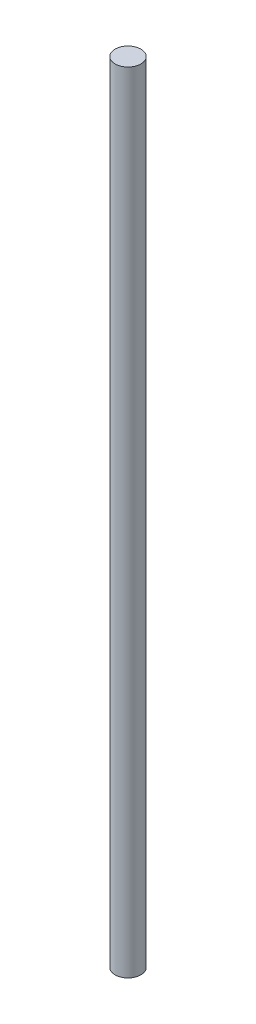
ISO-10303-21;
HEADER;
FILE_DESCRIPTION(('STEP AP214'),'2;1');
FILE_NAME('part.step','',(''),(''),'','','');
FILE_SCHEMA(('AUTOMOTIVE_DESIGN { 1 0 10303 214 1 1 1 1 }'));
ENDSEC;
DATA;
#1=APPLICATION_CONTEXT('core data for automotive mechanical design processes');
#2=APPLICATION_PROTOCOL_DEFINITION('international standard','automotive_design',2000,#1);
#3=PRODUCT_CONTEXT('',#1,'mechanical');
#4=PRODUCT('Part','Part','',(#3));
#5=PRODUCT_RELATED_PRODUCT_CATEGORY('part','',(#4));
#6=PRODUCT_DEFINITION_FORMATION('','',#4);
#7=PRODUCT_DEFINITION_CONTEXT('part definition',#1,'design');
#8=PRODUCT_DEFINITION('design','',#6,#7);
#9=PRODUCT_DEFINITION_SHAPE('','',#8);
#10=(LENGTH_UNIT() NAMED_UNIT(*) SI_UNIT(.MILLI.,.METRE.));
#11=(NAMED_UNIT(*) PLANE_ANGLE_UNIT() SI_UNIT($,.RADIAN.));
#12=(NAMED_UNIT(*) SI_UNIT($,.STERADIAN.) SOLID_ANGLE_UNIT());
#13=UNCERTAINTY_MEASURE_WITH_UNIT(LENGTH_MEASURE(1.E-05),#10,'distance_accuracy_value','');
#14=(GEOMETRIC_REPRESENTATION_CONTEXT(3) GLOBAL_UNCERTAINTY_ASSIGNED_CONTEXT((#13)) GLOBAL_UNIT_ASSIGNED_CONTEXT((#10,
#11,#12)) REPRESENTATION_CONTEXT('',''));
#15=CARTESIAN_POINT('',(0.,0.,0.));
#16=DIRECTION('',(0.,0.,1.));
#17=DIRECTION('',(1.,0.,0.));
#18=AXIS2_PLACEMENT_3D('',#15,#16,#17);
#19=CARTESIAN_POINT('',(0.,245.,0.));
#20=DIRECTION('',(0.,-1.,0.));
#21=DIRECTION('',(0.,0.,-1.));
#22=AXIS2_PLACEMENT_3D('',#19,#20,#21);
#23=CYLINDRICAL_SURFACE('',#22,4.);
#24=CARTESIAN_POINT('',(0.,245.,0.));
#25=DIRECTION('',(0.,1.,0.));
#26=DIRECTION('',(0.,0.,1.));
#27=AXIS2_PLACEMENT_3D('',#24,#25,#26);
#28=CIRCLE('',#27,4.);
#29=CARTESIAN_POINT('',(0.,245.,4.));
#30=VERTEX_POINT('',#29);
#31=EDGE_CURVE('E10',#30,#30,#28,.T.);
#32=ORIENTED_EDGE('',*,*,#31,.F.);
#33=EDGE_LOOP('',(#32));
#34=FACE_BOUND('',#33,.T.);
#35=CARTESIAN_POINT('',(0.,0.,0.));
#36=DIRECTION('',(0.,1.,0.));
#37=DIRECTION('',(0.,0.,1.));
#38=AXIS2_PLACEMENT_3D('',#35,#36,#37);
#39=CIRCLE('',#38,4.);
#40=CARTESIAN_POINT('',(0.,0.,4.));
#41=VERTEX_POINT('',#40);
#42=EDGE_CURVE('E34',#41,#41,#39,.T.);
#43=ORIENTED_EDGE('',*,*,#42,.T.);
#44=EDGE_LOOP('',(#43));
#45=FACE_BOUND('',#44,.T.);
#46=ADVANCED_FACE('F31',(#34,#45),#23,.T.);
#47=CARTESIAN_POINT('',(0.,245.,0.));
#48=DIRECTION('',(0.,1.,0.));
#49=DIRECTION('',(0.,0.,1.));
#50=AXIS2_PLACEMENT_3D('',#47,#48,#49);
#51=PLANE('',#50);
#52=ORIENTED_EDGE('',*,*,#31,.T.);
#53=EDGE_LOOP('',(#52));
#54=FACE_BOUND('',#53,.T.);
#55=ADVANCED_FACE('F46',(#54),#51,.T.);
#56=CARTESIAN_POINT('',(0.,0.,0.));
#57=DIRECTION('',(0.,1.,0.));
#58=DIRECTION('',(0.,0.,1.));
#59=AXIS2_PLACEMENT_3D('',#56,#57,#58);
#60=PLANE('',#59);
#61=ORIENTED_EDGE('',*,*,#42,.F.);
#62=EDGE_LOOP('',(#61));
#63=FACE_BOUND('',#62,.T.);
#64=ADVANCED_FACE('F44',(#63),#60,.F.);
#65=CLOSED_SHELL('',(#46,#55,#64));
#66=MANIFOLD_SOLID_BREP('B2',#65);
#67=ADVANCED_BREP_SHAPE_REPRESENTATION('',(#18,#66),#14);
#68=SHAPE_DEFINITION_REPRESENTATION(#9,#67);
ENDSEC;
END-ISO-10303-21;
